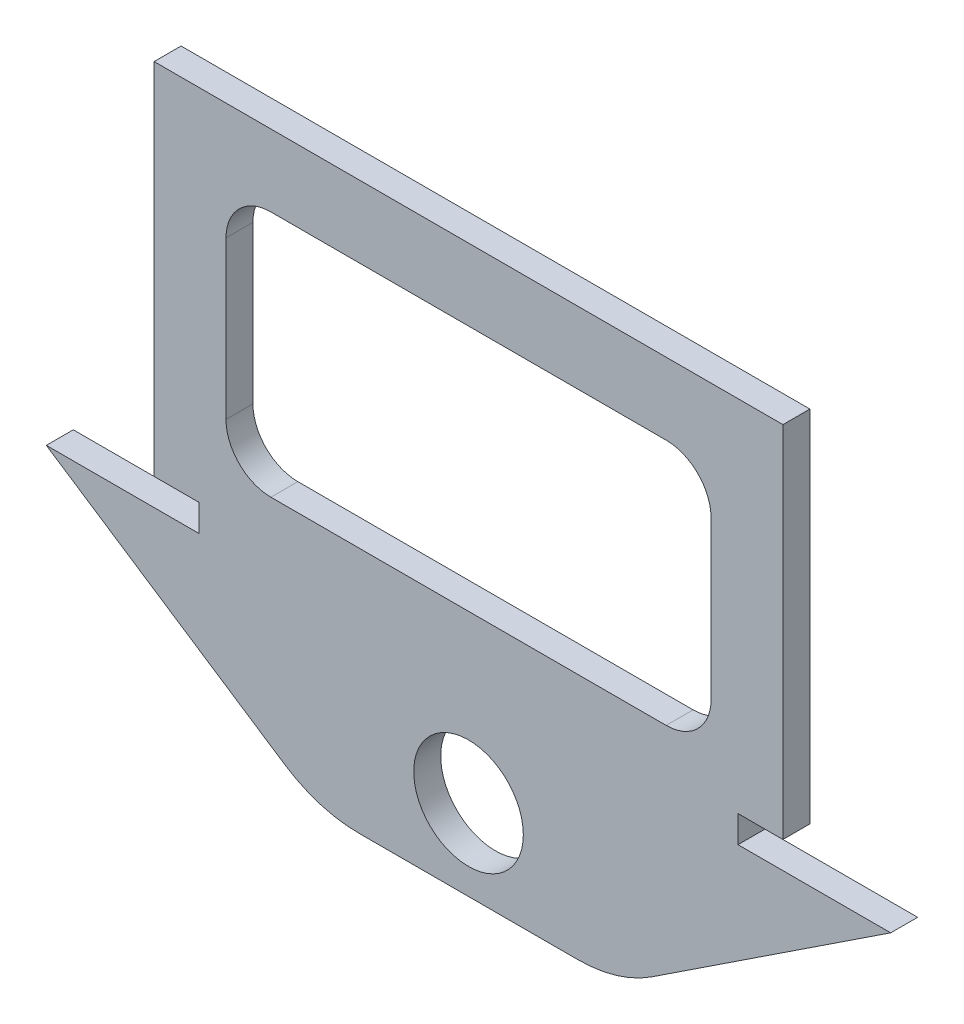
ISO-10303-21;
HEADER;
FILE_DESCRIPTION(('STEP AP214'),'2;1');
FILE_NAME('part.step','',(''),(''),'','','');
FILE_SCHEMA(('AUTOMOTIVE_DESIGN { 1 0 10303 214 1 1 1 1 }'));
ENDSEC;
DATA;
#1=APPLICATION_CONTEXT('core data for automotive mechanical design processes');
#2=APPLICATION_PROTOCOL_DEFINITION('international standard','automotive_design',2000,#1);
#3=PRODUCT_CONTEXT('',#1,'mechanical');
#4=PRODUCT('Part','Part','',(#3));
#5=PRODUCT_RELATED_PRODUCT_CATEGORY('part','',(#4));
#6=PRODUCT_DEFINITION_FORMATION('','',#4);
#7=PRODUCT_DEFINITION_CONTEXT('part definition',#1,'design');
#8=PRODUCT_DEFINITION('design','',#6,#7);
#9=PRODUCT_DEFINITION_SHAPE('','',#8);
#10=(LENGTH_UNIT() NAMED_UNIT(*) SI_UNIT(.MILLI.,.METRE.));
#11=(NAMED_UNIT(*) PLANE_ANGLE_UNIT() SI_UNIT($,.RADIAN.));
#12=(NAMED_UNIT(*) SI_UNIT($,.STERADIAN.) SOLID_ANGLE_UNIT());
#13=UNCERTAINTY_MEASURE_WITH_UNIT(LENGTH_MEASURE(1.E-05),#10,'distance_accuracy_value','');
#14=(GEOMETRIC_REPRESENTATION_CONTEXT(3) GLOBAL_UNCERTAINTY_ASSIGNED_CONTEXT((#13)) GLOBAL_UNIT_ASSIGNED_CONTEXT((#10,
#11,#12)) REPRESENTATION_CONTEXT('',''));
#15=CARTESIAN_POINT('',(0.,0.,0.));
#16=DIRECTION('',(0.,0.,1.));
#17=DIRECTION('',(1.,0.,0.));
#18=AXIS2_PLACEMENT_3D('',#15,#16,#17);
#19=CARTESIAN_POINT('',(-24.3453074442024,-10.,6.));
#20=DIRECTION('',(0.,0.,1.));
#21=DIRECTION('',(1.,0.,0.));
#22=AXIS2_PLACEMENT_3D('',#19,#20,#21);
#23=PLANE('',#22);
#24=DIRECTION('',(0.,-1.,0.));
#25=VECTOR('',#24,1.);
#26=CARTESIAN_POINT('',(-54.,60.,6.));
#27=LINE('',#26,#25);
#28=CARTESIAN_POINT('',(-54.,60.,6.));
#29=VERTEX_POINT('',#28);
#30=CARTESIAN_POINT('',(-54.,25.,6.));
#31=VERTEX_POINT('',#30);
#32=EDGE_CURVE('E189',#29,#31,#27,.T.);
#33=ORIENTED_EDGE('',*,*,#32,.F.);
#34=CARTESIAN_POINT('',(-44.,60.,6.));
#35=DIRECTION('',(0.,0.,1.));
#36=DIRECTION('',(1.,0.,0.));
#37=AXIS2_PLACEMENT_3D('',#34,#35,#36);
#38=CIRCLE('',#37,10.);
#39=CARTESIAN_POINT('',(-44.,70.,6.));
#40=VERTEX_POINT('',#39);
#41=EDGE_CURVE('E181',#40,#29,#38,.T.);
#42=ORIENTED_EDGE('',*,*,#41,.F.);
#43=DIRECTION('',(-1.,0.,0.));
#44=VECTOR('',#43,1.);
#45=CARTESIAN_POINT('',(-44.,70.,6.));
#46=LINE('',#45,#44);
#47=CARTESIAN_POINT('',(44.,70.,6.));
#48=VERTEX_POINT('',#47);
#49=EDGE_CURVE('E216',#48,#40,#46,.T.);
#50=ORIENTED_EDGE('',*,*,#49,.F.);
#51=CARTESIAN_POINT('',(44.,60.,6.));
#52=DIRECTION('',(0.,0.,1.));
#53=DIRECTION('',(-1.,0.,0.));
#54=AXIS2_PLACEMENT_3D('',#51,#52,#53);
#55=CIRCLE('',#54,10.);
#56=CARTESIAN_POINT('',(54.,60.,6.));
#57=VERTEX_POINT('',#56);
#58=EDGE_CURVE('E214',#57,#48,#55,.T.);
#59=ORIENTED_EDGE('',*,*,#58,.F.);
#60=DIRECTION('',(0.,1.,0.));
#61=VECTOR('',#60,1.);
#62=CARTESIAN_POINT('',(54.,60.,6.));
#63=LINE('',#62,#61);
#64=CARTESIAN_POINT('',(54.,25.,6.));
#65=VERTEX_POINT('',#64);
#66=EDGE_CURVE('E212',#65,#57,#63,.T.);
#67=ORIENTED_EDGE('',*,*,#66,.F.);
#68=CARTESIAN_POINT('',(44.,25.,6.));
#69=DIRECTION('',(0.,0.,1.));
#70=DIRECTION('',(-1.,0.,0.));
#71=AXIS2_PLACEMENT_3D('',#68,#69,#70);
#72=CIRCLE('',#71,10.);
#73=CARTESIAN_POINT('',(44.,15.,6.));
#74=VERTEX_POINT('',#73);
#75=EDGE_CURVE('E210',#74,#65,#72,.T.);
#76=ORIENTED_EDGE('',*,*,#75,.F.);
#77=DIRECTION('',(1.,0.,0.));
#78=VECTOR('',#77,1.);
#79=CARTESIAN_POINT('',(-44.,15.,6.));
#80=LINE('',#79,#78);
#81=CARTESIAN_POINT('',(-44.,15.,6.));
#82=VERTEX_POINT('',#81);
#83=EDGE_CURVE('E205',#82,#74,#80,.T.);
#84=ORIENTED_EDGE('',*,*,#83,.F.);
#85=CARTESIAN_POINT('',(-44.,25.,6.));
#86=DIRECTION('',(0.,0.,1.));
#87=DIRECTION('',(1.,0.,0.));
#88=AXIS2_PLACEMENT_3D('',#85,#86,#87);
#89=CIRCLE('',#88,10.);
#90=EDGE_CURVE('E203',#31,#82,#89,.T.);
#91=ORIENTED_EDGE('',*,*,#90,.F.);
#92=EDGE_LOOP('',(#33,#42,#50,#59,#67,#76,#84,#91));
#93=FACE_BOUND('',#92,.T.);
#94=DIRECTION('',(0.834805382866256,-0.550545159580505,0.));
#95=VECTOR('',#94,1.);
#96=CARTESIAN_POINT('',(-94.,0.,6.));
#97=LINE('',#96,#95);
#98=CARTESIAN_POINT('',(-94.,0.,6.));
#99=VERTEX_POINT('',#98);
#100=CARTESIAN_POINT('',(-40.8616622316176,-35.0441614859877,6.));
#101=VERTEX_POINT('',#100);
#102=EDGE_CURVE('E249',#99,#101,#97,.T.);
#103=ORIENTED_EDGE('',*,*,#102,.T.);
#104=CARTESIAN_POINT('',(-24.3453074442024,-10.,6.));
#105=DIRECTION('',(0.,0.,1.));
#106=DIRECTION('',(1.,0.,0.));
#107=AXIS2_PLACEMENT_3D('',#104,#105,#106);
#108=CIRCLE('',#107,30.);
#109=CARTESIAN_POINT('',(-24.3453074442024,-40.,6.));
#110=VERTEX_POINT('',#109);
#111=EDGE_CURVE('E252',#101,#110,#108,.T.);
#112=ORIENTED_EDGE('',*,*,#111,.T.);
#113=DIRECTION('',(1.,0.,0.));
#114=VECTOR('',#113,1.);
#115=CARTESIAN_POINT('',(-24.3453074442024,-40.,6.));
#116=LINE('',#115,#114);
#117=CARTESIAN_POINT('',(24.3453074442025,-40.,6.));
#118=VERTEX_POINT('',#117);
#119=EDGE_CURVE('E255',#110,#118,#116,.T.);
#120=ORIENTED_EDGE('',*,*,#119,.T.);
#121=CARTESIAN_POINT('',(24.3453074442025,-10.,6.));
#122=DIRECTION('',(0.,0.,1.));
#123=DIRECTION('',(-1.,0.,0.));
#124=AXIS2_PLACEMENT_3D('',#121,#122,#123);
#125=CIRCLE('',#124,30.);
#126=CARTESIAN_POINT('',(40.8616622316176,-35.0441614859877,6.));
#127=VERTEX_POINT('',#126);
#128=EDGE_CURVE('E257',#118,#127,#125,.T.);
#129=ORIENTED_EDGE('',*,*,#128,.T.);
#130=DIRECTION('',(0.834805382866256,0.550545159580505,0.));
#131=VECTOR('',#130,1.);
#132=CARTESIAN_POINT('',(94.,0.,6.));
#133=LINE('',#132,#131);
#134=CARTESIAN_POINT('',(94.,0.,6.));
#135=VERTEX_POINT('',#134);
#136=EDGE_CURVE('E259',#127,#135,#133,.T.);
#137=ORIENTED_EDGE('',*,*,#136,.T.);
#138=DIRECTION('',(-1.,0.,0.));
#139=VECTOR('',#138,1.);
#140=CARTESIAN_POINT('',(94.,0.,6.));
#141=LINE('',#140,#139);
#142=CARTESIAN_POINT('',(60.,0.,6.));
#143=VERTEX_POINT('',#142);
#144=EDGE_CURVE('E261',#135,#143,#141,.T.);
#145=ORIENTED_EDGE('',*,*,#144,.T.);
#146=DIRECTION('',(0.,1.,0.));
#147=VECTOR('',#146,1.);
#148=CARTESIAN_POINT('',(60.,0.,6.));
#149=LINE('',#148,#147);
#150=CARTESIAN_POINT('',(60.,6.00000000000005,6.));
#151=VERTEX_POINT('',#150);
#152=EDGE_CURVE('E263',#143,#151,#149,.T.);
#153=ORIENTED_EDGE('',*,*,#152,.T.);
#154=DIRECTION('',(1.,0.,0.));
#155=VECTOR('',#154,1.);
#156=CARTESIAN_POINT('',(60.,6.00000000000005,6.));
#157=LINE('',#156,#155);
#158=CARTESIAN_POINT('',(70.,6.00000000000005,6.));
#159=VERTEX_POINT('',#158);
#160=EDGE_CURVE('E265',#151,#159,#157,.T.);
#161=ORIENTED_EDGE('',*,*,#160,.T.);
#162=DIRECTION('',(0.,1.,0.));
#163=VECTOR('',#162,1.);
#164=CARTESIAN_POINT('',(70.,6.00000000000005,6.));
#165=LINE('',#164,#163);
#166=CARTESIAN_POINT('',(70.,86.,6.));
#167=VERTEX_POINT('',#166);
#168=EDGE_CURVE('E267',#159,#167,#165,.T.);
#169=ORIENTED_EDGE('',*,*,#168,.T.);
#170=DIRECTION('',(-1.,0.,0.));
#171=VECTOR('',#170,1.);
#172=CARTESIAN_POINT('',(-70.,86.,6.));
#173=LINE('',#172,#171);
#174=CARTESIAN_POINT('',(-70.,86.,6.));
#175=VERTEX_POINT('',#174);
#176=EDGE_CURVE('E269',#167,#175,#173,.T.);
#177=ORIENTED_EDGE('',*,*,#176,.T.);
#178=DIRECTION('',(0.,-1.,0.));
#179=VECTOR('',#178,1.);
#180=CARTESIAN_POINT('',(-70.,6.,6.));
#181=LINE('',#180,#179);
#182=CARTESIAN_POINT('',(-70.,6.,6.));
#183=VERTEX_POINT('',#182);
#184=EDGE_CURVE('E271',#175,#183,#181,.T.);
#185=ORIENTED_EDGE('',*,*,#184,.T.);
#186=DIRECTION('',(1.,0.,0.));
#187=VECTOR('',#186,1.);
#188=CARTESIAN_POINT('',(-60.,6.,6.));
#189=LINE('',#188,#187);
#190=CARTESIAN_POINT('',(-60.,6.,6.));
#191=VERTEX_POINT('',#190);
#192=EDGE_CURVE('E273',#183,#191,#189,.T.);
#193=ORIENTED_EDGE('',*,*,#192,.T.);
#194=DIRECTION('',(0.,-1.,0.));
#195=VECTOR('',#194,1.);
#196=CARTESIAN_POINT('',(-60.,0.,6.));
#197=LINE('',#196,#195);
#198=CARTESIAN_POINT('',(-60.,0.,6.));
#199=VERTEX_POINT('',#198);
#200=EDGE_CURVE('E275',#191,#199,#197,.T.);
#201=ORIENTED_EDGE('',*,*,#200,.T.);
#202=DIRECTION('',(-1.,0.,0.));
#203=VECTOR('',#202,1.);
#204=CARTESIAN_POINT('',(-94.,0.,6.));
#205=LINE('',#204,#203);
#206=EDGE_CURVE('E277',#199,#99,#205,.T.);
#207=ORIENTED_EDGE('',*,*,#206,.T.);
#208=EDGE_LOOP('',(#103,#112,#120,#129,#137,#145,#153,#161,#169,#177,#185,#193,#201,#207));
#209=FACE_BOUND('',#208,.T.);
#210=CARTESIAN_POINT('',(0.,-22.,6.));
#211=DIRECTION('',(0.,0.,1.));
#212=DIRECTION('',(1.,0.,0.));
#213=AXIS2_PLACEMENT_3D('',#210,#211,#212);
#214=CIRCLE('',#213,12.2);
#215=CARTESIAN_POINT('',(12.2,-22.,6.));
#216=VERTEX_POINT('',#215);
#217=EDGE_CURVE('E219',#216,#216,#214,.T.);
#218=ORIENTED_EDGE('',*,*,#217,.F.);
#219=EDGE_LOOP('',(#218));
#220=FACE_BOUND('',#219,.T.);
#221=ADVANCED_FACE('F32',(#93,#209,#220),#23,.T.);
#222=CARTESIAN_POINT('',(-24.3453074442024,-10.,0.));
#223=DIRECTION('',(0.,0.,1.));
#224=DIRECTION('',(1.,0.,0.));
#225=AXIS2_PLACEMENT_3D('',#222,#223,#224);
#226=PLANE('',#225);
#227=DIRECTION('',(0.834805382866256,-0.550545159580505,0.));
#228=VECTOR('',#227,1.);
#229=CARTESIAN_POINT('',(-94.,0.,0.));
#230=LINE('',#229,#228);
#231=CARTESIAN_POINT('',(-94.,0.,0.));
#232=VERTEX_POINT('',#231);
#233=CARTESIAN_POINT('',(-40.8616622316176,-35.0441614859877,0.));
#234=VERTEX_POINT('',#233);
#235=EDGE_CURVE('E197',#232,#234,#230,.T.);
#236=ORIENTED_EDGE('',*,*,#235,.F.);
#237=DIRECTION('',(-1.,0.,0.));
#238=VECTOR('',#237,1.);
#239=CARTESIAN_POINT('',(-94.,0.,0.));
#240=LINE('',#239,#238);
#241=CARTESIAN_POINT('',(-60.,0.,0.));
#242=VERTEX_POINT('',#241);
#243=EDGE_CURVE('E253',#242,#232,#240,.T.);
#244=ORIENTED_EDGE('',*,*,#243,.F.);
#245=DIRECTION('',(0.,-1.,0.));
#246=VECTOR('',#245,1.);
#247=CARTESIAN_POINT('',(-60.,0.,0.));
#248=LINE('',#247,#246);
#249=CARTESIAN_POINT('',(-60.,6.,0.));
#250=VERTEX_POINT('',#249);
#251=EDGE_CURVE('E304',#250,#242,#248,.T.);
#252=ORIENTED_EDGE('',*,*,#251,.F.);
#253=DIRECTION('',(1.,0.,0.));
#254=VECTOR('',#253,1.);
#255=CARTESIAN_POINT('',(-60.,6.,0.));
#256=LINE('',#255,#254);
#257=CARTESIAN_POINT('',(-70.,6.,0.));
#258=VERTEX_POINT('',#257);
#259=EDGE_CURVE('E302',#258,#250,#256,.T.);
#260=ORIENTED_EDGE('',*,*,#259,.F.);
#261=DIRECTION('',(0.,-1.,0.));
#262=VECTOR('',#261,1.);
#263=CARTESIAN_POINT('',(-70.,6.,0.));
#264=LINE('',#263,#262);
#265=CARTESIAN_POINT('',(-70.,86.,0.));
#266=VERTEX_POINT('',#265);
#267=EDGE_CURVE('E300',#266,#258,#264,.T.);
#268=ORIENTED_EDGE('',*,*,#267,.F.);
#269=DIRECTION('',(-1.,0.,0.));
#270=VECTOR('',#269,1.);
#271=CARTESIAN_POINT('',(-70.,86.,0.));
#272=LINE('',#271,#270);
#273=CARTESIAN_POINT('',(70.,86.,0.));
#274=VERTEX_POINT('',#273);
#275=EDGE_CURVE('E298',#274,#266,#272,.T.);
#276=ORIENTED_EDGE('',*,*,#275,.F.);
#277=DIRECTION('',(0.,1.,0.));
#278=VECTOR('',#277,1.);
#279=CARTESIAN_POINT('',(70.,6.00000000000005,0.));
#280=LINE('',#279,#278);
#281=CARTESIAN_POINT('',(70.,6.00000000000005,0.));
#282=VERTEX_POINT('',#281);
#283=EDGE_CURVE('E296',#282,#274,#280,.T.);
#284=ORIENTED_EDGE('',*,*,#283,.F.);
#285=DIRECTION('',(1.,0.,0.));
#286=VECTOR('',#285,1.);
#287=CARTESIAN_POINT('',(60.,6.00000000000005,0.));
#288=LINE('',#287,#286);
#289=CARTESIAN_POINT('',(60.,6.00000000000005,0.));
#290=VERTEX_POINT('',#289);
#291=EDGE_CURVE('E294',#290,#282,#288,.T.);
#292=ORIENTED_EDGE('',*,*,#291,.F.);
#293=DIRECTION('',(0.,1.,0.));
#294=VECTOR('',#293,1.);
#295=CARTESIAN_POINT('',(60.,0.,0.));
#296=LINE('',#295,#294);
#297=CARTESIAN_POINT('',(60.,0.,0.));
#298=VERTEX_POINT('',#297);
#299=EDGE_CURVE('E292',#298,#290,#296,.T.);
#300=ORIENTED_EDGE('',*,*,#299,.F.);
#301=DIRECTION('',(-1.,0.,0.));
#302=VECTOR('',#301,1.);
#303=CARTESIAN_POINT('',(94.,0.,0.));
#304=LINE('',#303,#302);
#305=CARTESIAN_POINT('',(94.,0.,0.));
#306=VERTEX_POINT('',#305);
#307=EDGE_CURVE('E290',#306,#298,#304,.T.);
#308=ORIENTED_EDGE('',*,*,#307,.F.);
#309=DIRECTION('',(0.834805382866256,0.550545159580505,0.));
#310=VECTOR('',#309,1.);
#311=CARTESIAN_POINT('',(94.,0.,0.));
#312=LINE('',#311,#310);
#313=CARTESIAN_POINT('',(40.8616622316176,-35.0441614859877,0.));
#314=VERTEX_POINT('',#313);
#315=EDGE_CURVE('E288',#314,#306,#312,.T.);
#316=ORIENTED_EDGE('',*,*,#315,.F.);
#317=CARTESIAN_POINT('',(24.3453074442025,-10.,0.));
#318=DIRECTION('',(0.,0.,1.));
#319=DIRECTION('',(-1.,0.,0.));
#320=AXIS2_PLACEMENT_3D('',#317,#318,#319);
#321=CIRCLE('',#320,30.);
#322=CARTESIAN_POINT('',(24.3453074442025,-40.,0.));
#323=VERTEX_POINT('',#322);
#324=EDGE_CURVE('E286',#323,#314,#321,.T.);
#325=ORIENTED_EDGE('',*,*,#324,.F.);
#326=DIRECTION('',(1.,0.,0.));
#327=VECTOR('',#326,1.);
#328=CARTESIAN_POINT('',(-24.3453074442024,-40.,0.));
#329=LINE('',#328,#327);
#330=CARTESIAN_POINT('',(-24.3453074442024,-40.,0.));
#331=VERTEX_POINT('',#330);
#332=EDGE_CURVE('E284',#331,#323,#329,.T.);
#333=ORIENTED_EDGE('',*,*,#332,.F.);
#334=CARTESIAN_POINT('',(-24.3453074442024,-10.,0.));
#335=DIRECTION('',(0.,0.,1.));
#336=DIRECTION('',(1.,0.,0.));
#337=AXIS2_PLACEMENT_3D('',#334,#335,#336);
#338=CIRCLE('',#337,30.);
#339=EDGE_CURVE('E282',#234,#331,#338,.T.);
#340=ORIENTED_EDGE('',*,*,#339,.F.);
#341=EDGE_LOOP('',(#236,#244,#252,#260,#268,#276,#284,#292,#300,#308,#316,#325,#333,#340));
#342=FACE_BOUND('',#341,.T.);
#343=CARTESIAN_POINT('',(-44.,60.,0.));
#344=DIRECTION('',(0.,0.,1.));
#345=DIRECTION('',(1.,0.,0.));
#346=AXIS2_PLACEMENT_3D('',#343,#344,#345);
#347=CIRCLE('',#346,10.);
#348=CARTESIAN_POINT('',(-44.,70.,0.));
#349=VERTEX_POINT('',#348);
#350=CARTESIAN_POINT('',(-54.,60.,0.));
#351=VERTEX_POINT('',#350);
#352=EDGE_CURVE('E55',#349,#351,#347,.T.);
#353=ORIENTED_EDGE('',*,*,#352,.T.);
#354=DIRECTION('',(0.,-1.,0.));
#355=VECTOR('',#354,1.);
#356=CARTESIAN_POINT('',(-54.,60.,0.));
#357=LINE('',#356,#355);
#358=CARTESIAN_POINT('',(-54.,25.,0.));
#359=VERTEX_POINT('',#358);
#360=EDGE_CURVE('E196',#351,#359,#357,.T.);
#361=ORIENTED_EDGE('',*,*,#360,.T.);
#362=CARTESIAN_POINT('',(-44.,25.,0.));
#363=DIRECTION('',(0.,0.,1.));
#364=DIRECTION('',(1.,0.,0.));
#365=AXIS2_PLACEMENT_3D('',#362,#363,#364);
#366=CIRCLE('',#365,10.);
#367=CARTESIAN_POINT('',(-44.,15.,0.));
#368=VERTEX_POINT('',#367);
#369=EDGE_CURVE('E221',#359,#368,#366,.T.);
#370=ORIENTED_EDGE('',*,*,#369,.T.);
#371=DIRECTION('',(1.,0.,0.));
#372=VECTOR('',#371,1.);
#373=CARTESIAN_POINT('',(-44.,15.,0.));
#374=LINE('',#373,#372);
#375=CARTESIAN_POINT('',(44.,15.,0.));
#376=VERTEX_POINT('',#375);
#377=EDGE_CURVE('E224',#368,#376,#374,.T.);
#378=ORIENTED_EDGE('',*,*,#377,.T.);
#379=CARTESIAN_POINT('',(44.,25.,0.));
#380=DIRECTION('',(0.,0.,1.));
#381=DIRECTION('',(-1.,0.,0.));
#382=AXIS2_PLACEMENT_3D('',#379,#380,#381);
#383=CIRCLE('',#382,10.);
#384=CARTESIAN_POINT('',(54.,25.,0.));
#385=VERTEX_POINT('',#384);
#386=EDGE_CURVE('E227',#376,#385,#383,.T.);
#387=ORIENTED_EDGE('',*,*,#386,.T.);
#388=DIRECTION('',(0.,1.,0.));
#389=VECTOR('',#388,1.);
#390=CARTESIAN_POINT('',(54.,60.,0.));
#391=LINE('',#390,#389);
#392=CARTESIAN_POINT('',(54.,60.,0.));
#393=VERTEX_POINT('',#392);
#394=EDGE_CURVE('E230',#385,#393,#391,.T.);
#395=ORIENTED_EDGE('',*,*,#394,.T.);
#396=CARTESIAN_POINT('',(44.,60.,0.));
#397=DIRECTION('',(0.,0.,1.));
#398=DIRECTION('',(-1.,0.,0.));
#399=AXIS2_PLACEMENT_3D('',#396,#397,#398);
#400=CIRCLE('',#399,10.);
#401=CARTESIAN_POINT('',(44.,70.,0.));
#402=VERTEX_POINT('',#401);
#403=EDGE_CURVE('E233',#393,#402,#400,.T.);
#404=ORIENTED_EDGE('',*,*,#403,.T.);
#405=DIRECTION('',(-1.,0.,0.));
#406=VECTOR('',#405,1.);
#407=CARTESIAN_POINT('',(-44.,70.,0.));
#408=LINE('',#407,#406);
#409=EDGE_CURVE('E190',#402,#349,#408,.T.);
#410=ORIENTED_EDGE('',*,*,#409,.T.);
#411=EDGE_LOOP('',(#353,#361,#370,#378,#387,#395,#404,#410));
#412=FACE_BOUND('',#411,.T.);
#413=CARTESIAN_POINT('',(0.,-22.,0.));
#414=DIRECTION('',(0.,0.,1.));
#415=DIRECTION('',(1.,0.,0.));
#416=AXIS2_PLACEMENT_3D('',#413,#414,#415);
#417=CIRCLE('',#416,12.2);
#418=CARTESIAN_POINT('',(12.2,-22.,0.));
#419=VERTEX_POINT('',#418);
#420=EDGE_CURVE('E629',#419,#419,#417,.T.);
#421=ORIENTED_EDGE('',*,*,#420,.T.);
#422=EDGE_LOOP('',(#421));
#423=FACE_BOUND('',#422,.T.);
#424=ADVANCED_FACE('F352',(#342,#412,#423),#226,.F.);
#425=CARTESIAN_POINT('',(-94.,0.,6.));
#426=DIRECTION('',(0.550545159580505,0.834805382866256,0.));
#427=DIRECTION('',(-0.834805382866256,0.550545159580505,0.));
#428=AXIS2_PLACEMENT_3D('',#425,#426,#427);
#429=PLANE('',#428);
#430=ORIENTED_EDGE('',*,*,#235,.T.);
#431=DIRECTION('',(0.,0.,-1.));
#432=VECTOR('',#431,1.);
#433=CARTESIAN_POINT('',(-40.8616622316176,-35.0441614859877,6.));
#434=LINE('',#433,#432);
#435=EDGE_CURVE('E11',#101,#234,#434,.T.);
#436=ORIENTED_EDGE('',*,*,#435,.F.);
#437=ORIENTED_EDGE('',*,*,#102,.F.);
#438=DIRECTION('',(0.,0.,-1.));
#439=VECTOR('',#438,1.);
#440=CARTESIAN_POINT('',(-94.,0.,6.));
#441=LINE('',#440,#439);
#442=EDGE_CURVE('E279',#99,#232,#441,.T.);
#443=ORIENTED_EDGE('',*,*,#442,.T.);
#444=EDGE_LOOP('',(#430,#436,#437,#443));
#445=FACE_BOUND('',#444,.T.);
#446=ADVANCED_FACE('F34',(#445),#429,.F.);
#447=CARTESIAN_POINT('',(-24.3453074442024,-10.,6.));
#448=DIRECTION('',(0.,0.,-1.));
#449=DIRECTION('',(-1.,0.,0.));
#450=AXIS2_PLACEMENT_3D('',#447,#448,#449);
#451=CYLINDRICAL_SURFACE('',#450,30.);
#452=ORIENTED_EDGE('',*,*,#339,.T.);
#453=DIRECTION('',(0.,0.,-1.));
#454=VECTOR('',#453,1.);
#455=CARTESIAN_POINT('',(-24.3453074442024,-40.,6.));
#456=LINE('',#455,#454);
#457=EDGE_CURVE('E40',#110,#331,#456,.T.);
#458=ORIENTED_EDGE('',*,*,#457,.F.);
#459=ORIENTED_EDGE('',*,*,#111,.F.);
#460=ORIENTED_EDGE('',*,*,#435,.T.);
#461=EDGE_LOOP('',(#452,#458,#459,#460));
#462=FACE_BOUND('',#461,.T.);
#463=ADVANCED_FACE('F369',(#462),#451,.T.);
#464=CARTESIAN_POINT('',(-24.3453074442024,-40.,6.));
#465=DIRECTION('',(0.,1.,0.));
#466=DIRECTION('',(-1.,0.,0.));
#467=AXIS2_PLACEMENT_3D('',#464,#465,#466);
#468=PLANE('',#467);
#469=ORIENTED_EDGE('',*,*,#332,.T.);
#470=DIRECTION('',(0.,0.,-1.));
#471=VECTOR('',#470,1.);
#472=CARTESIAN_POINT('',(24.3453074442025,-40.,6.));
#473=LINE('',#472,#471);
#474=EDGE_CURVE('E339',#118,#323,#473,.T.);
#475=ORIENTED_EDGE('',*,*,#474,.F.);
#476=ORIENTED_EDGE('',*,*,#119,.F.);
#477=ORIENTED_EDGE('',*,*,#457,.T.);
#478=EDGE_LOOP('',(#469,#475,#476,#477));
#479=FACE_BOUND('',#478,.T.);
#480=ADVANCED_FACE('F346',(#479),#468,.F.);
#481=CARTESIAN_POINT('',(24.3453074442025,-10.,6.));
#482=DIRECTION('',(0.,0.,-1.));
#483=DIRECTION('',(-1.,0.,0.));
#484=AXIS2_PLACEMENT_3D('',#481,#482,#483);
#485=CYLINDRICAL_SURFACE('',#484,30.);
#486=ORIENTED_EDGE('',*,*,#324,.T.);
#487=DIRECTION('',(0.,0.,-1.));
#488=VECTOR('',#487,1.);
#489=CARTESIAN_POINT('',(40.8616622316176,-35.0441614859877,6.));
#490=LINE('',#489,#488);
#491=EDGE_CURVE('E336',#127,#314,#490,.T.);
#492=ORIENTED_EDGE('',*,*,#491,.F.);
#493=ORIENTED_EDGE('',*,*,#128,.F.);
#494=ORIENTED_EDGE('',*,*,#474,.T.);
#495=EDGE_LOOP('',(#486,#492,#493,#494));
#496=FACE_BOUND('',#495,.T.);
#497=ADVANCED_FACE('F358',(#496),#485,.T.);
#498=CARTESIAN_POINT('',(94.,0.,6.));
#499=DIRECTION('',(-0.550545159580505,0.834805382866256,0.));
#500=DIRECTION('',(-0.834805382866256,-0.550545159580505,0.));
#501=AXIS2_PLACEMENT_3D('',#498,#499,#500);
#502=PLANE('',#501);
#503=ORIENTED_EDGE('',*,*,#315,.T.);
#504=DIRECTION('',(0.,0.,-1.));
#505=VECTOR('',#504,1.);
#506=CARTESIAN_POINT('',(94.,0.,6.));
#507=LINE('',#506,#505);
#508=EDGE_CURVE('E333',#135,#306,#507,.T.);
#509=ORIENTED_EDGE('',*,*,#508,.F.);
#510=ORIENTED_EDGE('',*,*,#136,.F.);
#511=ORIENTED_EDGE('',*,*,#491,.T.);
#512=EDGE_LOOP('',(#503,#509,#510,#511));
#513=FACE_BOUND('',#512,.T.);
#514=ADVANCED_FACE('F362',(#513),#502,.F.);
#515=CARTESIAN_POINT('',(94.,0.,6.));
#516=DIRECTION('',(0.,-1.,0.));
#517=DIRECTION('',(1.,0.,0.));
#518=AXIS2_PLACEMENT_3D('',#515,#516,#517);
#519=PLANE('',#518);
#520=ORIENTED_EDGE('',*,*,#307,.T.);
#521=DIRECTION('',(0.,0.,-1.));
#522=VECTOR('',#521,1.);
#523=CARTESIAN_POINT('',(60.,0.,6.));
#524=LINE('',#523,#522);
#525=EDGE_CURVE('E330',#143,#298,#524,.T.);
#526=ORIENTED_EDGE('',*,*,#525,.F.);
#527=ORIENTED_EDGE('',*,*,#144,.F.);
#528=ORIENTED_EDGE('',*,*,#508,.T.);
#529=EDGE_LOOP('',(#520,#526,#527,#528));
#530=FACE_BOUND('',#529,.T.);
#531=ADVANCED_FACE('F412',(#530),#519,.F.);
#532=CARTESIAN_POINT('',(60.,0.,6.));
#533=DIRECTION('',(-1.,0.,0.));
#534=DIRECTION('',(0.,0.,1.));
#535=AXIS2_PLACEMENT_3D('',#532,#533,#534);
#536=PLANE('',#535);
#537=ORIENTED_EDGE('',*,*,#299,.T.);
#538=DIRECTION('',(0.,0.,-1.));
#539=VECTOR('',#538,1.);
#540=CARTESIAN_POINT('',(60.,6.00000000000005,6.));
#541=LINE('',#540,#539);
#542=EDGE_CURVE('E327',#151,#290,#541,.T.);
#543=ORIENTED_EDGE('',*,*,#542,.F.);
#544=ORIENTED_EDGE('',*,*,#152,.F.);
#545=ORIENTED_EDGE('',*,*,#525,.T.);
#546=EDGE_LOOP('',(#537,#543,#544,#545));
#547=FACE_BOUND('',#546,.T.);
#548=ADVANCED_FACE('F410',(#547),#536,.F.);
#549=CARTESIAN_POINT('',(60.,6.00000000000005,6.));
#550=DIRECTION('',(0.,1.,0.));
#551=DIRECTION('',(0.,0.,1.));
#552=AXIS2_PLACEMENT_3D('',#549,#550,#551);
#553=PLANE('',#552);
#554=ORIENTED_EDGE('',*,*,#291,.T.);
#555=DIRECTION('',(0.,0.,-1.));
#556=VECTOR('',#555,1.);
#557=CARTESIAN_POINT('',(70.,6.00000000000005,6.));
#558=LINE('',#557,#556);
#559=EDGE_CURVE('E324',#159,#282,#558,.T.);
#560=ORIENTED_EDGE('',*,*,#559,.F.);
#561=ORIENTED_EDGE('',*,*,#160,.F.);
#562=ORIENTED_EDGE('',*,*,#542,.T.);
#563=EDGE_LOOP('',(#554,#560,#561,#562));
#564=FACE_BOUND('',#563,.T.);
#565=ADVANCED_FACE('F405',(#564),#553,.F.);
#566=CARTESIAN_POINT('',(70.,6.00000000000005,6.));
#567=DIRECTION('',(-1.,0.,0.));
#568=DIRECTION('',(0.,0.,1.));
#569=AXIS2_PLACEMENT_3D('',#566,#567,#568);
#570=PLANE('',#569);
#571=ORIENTED_EDGE('',*,*,#283,.T.);
#572=DIRECTION('',(0.,0.,-1.));
#573=VECTOR('',#572,1.);
#574=CARTESIAN_POINT('',(70.,86.,6.));
#575=LINE('',#574,#573);
#576=EDGE_CURVE('E321',#167,#274,#575,.T.);
#577=ORIENTED_EDGE('',*,*,#576,.F.);
#578=ORIENTED_EDGE('',*,*,#168,.F.);
#579=ORIENTED_EDGE('',*,*,#559,.T.);
#580=EDGE_LOOP('',(#571,#577,#578,#579));
#581=FACE_BOUND('',#580,.T.);
#582=ADVANCED_FACE('F400',(#581),#570,.F.);
#583=CARTESIAN_POINT('',(-70.,86.,6.));
#584=DIRECTION('',(0.,-1.,0.));
#585=DIRECTION('',(1.,0.,0.));
#586=AXIS2_PLACEMENT_3D('',#583,#584,#585);
#587=PLANE('',#586);
#588=ORIENTED_EDGE('',*,*,#275,.T.);
#589=DIRECTION('',(0.,0.,-1.));
#590=VECTOR('',#589,1.);
#591=CARTESIAN_POINT('',(-70.,86.,6.));
#592=LINE('',#591,#590);
#593=EDGE_CURVE('E318',#175,#266,#592,.T.);
#594=ORIENTED_EDGE('',*,*,#593,.F.);
#595=ORIENTED_EDGE('',*,*,#176,.F.);
#596=ORIENTED_EDGE('',*,*,#576,.T.);
#597=EDGE_LOOP('',(#588,#594,#595,#596));
#598=FACE_BOUND('',#597,.T.);
#599=ADVANCED_FACE('F396',(#598),#587,.F.);
#600=CARTESIAN_POINT('',(-70.,6.,6.));
#601=DIRECTION('',(1.,0.,0.));
#602=DIRECTION('',(0.,0.,-1.));
#603=AXIS2_PLACEMENT_3D('',#600,#601,#602);
#604=PLANE('',#603);
#605=ORIENTED_EDGE('',*,*,#267,.T.);
#606=DIRECTION('',(0.,0.,-1.));
#607=VECTOR('',#606,1.);
#608=CARTESIAN_POINT('',(-70.,6.,6.));
#609=LINE('',#608,#607);
#610=EDGE_CURVE('E315',#183,#258,#609,.T.);
#611=ORIENTED_EDGE('',*,*,#610,.F.);
#612=ORIENTED_EDGE('',*,*,#184,.F.);
#613=ORIENTED_EDGE('',*,*,#593,.T.);
#614=EDGE_LOOP('',(#605,#611,#612,#613));
#615=FACE_BOUND('',#614,.T.);
#616=ADVANCED_FACE('F391',(#615),#604,.F.);
#617=CARTESIAN_POINT('',(-60.,6.,6.));
#618=DIRECTION('',(0.,1.,0.));
#619=DIRECTION('',(0.,0.,1.));
#620=AXIS2_PLACEMENT_3D('',#617,#618,#619);
#621=PLANE('',#620);
#622=ORIENTED_EDGE('',*,*,#259,.T.);
#623=DIRECTION('',(0.,0.,-1.));
#624=VECTOR('',#623,1.);
#625=CARTESIAN_POINT('',(-60.,6.,6.));
#626=LINE('',#625,#624);
#627=EDGE_CURVE('E312',#191,#250,#626,.T.);
#628=ORIENTED_EDGE('',*,*,#627,.F.);
#629=ORIENTED_EDGE('',*,*,#192,.F.);
#630=ORIENTED_EDGE('',*,*,#610,.T.);
#631=EDGE_LOOP('',(#622,#628,#629,#630));
#632=FACE_BOUND('',#631,.T.);
#633=ADVANCED_FACE('F385',(#632),#621,.F.);
#634=CARTESIAN_POINT('',(-60.,0.,6.));
#635=DIRECTION('',(1.,0.,0.));
#636=DIRECTION('',(0.,0.,-1.));
#637=AXIS2_PLACEMENT_3D('',#634,#635,#636);
#638=PLANE('',#637);
#639=ORIENTED_EDGE('',*,*,#251,.T.);
#640=DIRECTION('',(0.,0.,-1.));
#641=VECTOR('',#640,1.);
#642=CARTESIAN_POINT('',(-60.,0.,6.));
#643=LINE('',#642,#641);
#644=EDGE_CURVE('E309',#199,#242,#643,.T.);
#645=ORIENTED_EDGE('',*,*,#644,.F.);
#646=ORIENTED_EDGE('',*,*,#200,.F.);
#647=ORIENTED_EDGE('',*,*,#627,.T.);
#648=EDGE_LOOP('',(#639,#645,#646,#647));
#649=FACE_BOUND('',#648,.T.);
#650=ADVANCED_FACE('F381',(#649),#638,.F.);
#651=CARTESIAN_POINT('',(-94.,0.,6.));
#652=DIRECTION('',(0.,-1.,0.));
#653=DIRECTION('',(1.,0.,0.));
#654=AXIS2_PLACEMENT_3D('',#651,#652,#653);
#655=PLANE('',#654);
#656=ORIENTED_EDGE('',*,*,#243,.T.);
#657=ORIENTED_EDGE('',*,*,#442,.F.);
#658=ORIENTED_EDGE('',*,*,#206,.F.);
#659=ORIENTED_EDGE('',*,*,#644,.T.);
#660=EDGE_LOOP('',(#656,#657,#658,#659));
#661=FACE_BOUND('',#660,.T.);
#662=ADVANCED_FACE('F376',(#661),#655,.F.);
#663=CARTESIAN_POINT('',(-44.,60.,6.));
#664=DIRECTION('',(0.,0.,-1.));
#665=DIRECTION('',(-1.,0.,0.));
#666=AXIS2_PLACEMENT_3D('',#663,#664,#665);
#667=CYLINDRICAL_SURFACE('',#666,10.);
#668=ORIENTED_EDGE('',*,*,#352,.F.);
#669=DIRECTION('',(0.,0.,-1.));
#670=VECTOR('',#669,1.);
#671=CARTESIAN_POINT('',(-44.,70.,6.));
#672=LINE('',#671,#670);
#673=EDGE_CURVE('E185',#40,#349,#672,.T.);
#674=ORIENTED_EDGE('',*,*,#673,.F.);
#675=ORIENTED_EDGE('',*,*,#41,.T.);
#676=DIRECTION('',(0.,0.,-1.));
#677=VECTOR('',#676,1.);
#678=CARTESIAN_POINT('',(-54.,60.,6.));
#679=LINE('',#678,#677);
#680=EDGE_CURVE('E184',#29,#351,#679,.T.);
#681=ORIENTED_EDGE('',*,*,#680,.T.);
#682=EDGE_LOOP('',(#668,#674,#675,#681));
#683=FACE_BOUND('',#682,.T.);
#684=ADVANCED_FACE('F183',(#683),#667,.F.);
#685=CARTESIAN_POINT('',(-54.,60.,6.));
#686=DIRECTION('',(1.,0.,0.));
#687=DIRECTION('',(0.,0.,-1.));
#688=AXIS2_PLACEMENT_3D('',#685,#686,#687);
#689=PLANE('',#688);
#690=ORIENTED_EDGE('',*,*,#360,.F.);
#691=ORIENTED_EDGE('',*,*,#680,.F.);
#692=ORIENTED_EDGE('',*,*,#32,.T.);
#693=DIRECTION('',(0.,0.,-1.));
#694=VECTOR('',#693,1.);
#695=CARTESIAN_POINT('',(-54.,25.,6.));
#696=LINE('',#695,#694);
#697=EDGE_CURVE('E198',#31,#359,#696,.T.);
#698=ORIENTED_EDGE('',*,*,#697,.T.);
#699=EDGE_LOOP('',(#690,#691,#692,#698));
#700=FACE_BOUND('',#699,.T.);
#701=ADVANCED_FACE('F193',(#700),#689,.T.);
#702=CARTESIAN_POINT('',(-44.,25.,6.));
#703=DIRECTION('',(0.,0.,-1.));
#704=DIRECTION('',(-1.,0.,0.));
#705=AXIS2_PLACEMENT_3D('',#702,#703,#704);
#706=CYLINDRICAL_SURFACE('',#705,10.);
#707=ORIENTED_EDGE('',*,*,#369,.F.);
#708=ORIENTED_EDGE('',*,*,#697,.F.);
#709=ORIENTED_EDGE('',*,*,#90,.T.);
#710=DIRECTION('',(0.,0.,-1.));
#711=VECTOR('',#710,1.);
#712=CARTESIAN_POINT('',(-44.,15.,6.));
#713=LINE('',#712,#711);
#714=EDGE_CURVE('E246',#82,#368,#713,.T.);
#715=ORIENTED_EDGE('',*,*,#714,.T.);
#716=EDGE_LOOP('',(#707,#708,#709,#715));
#717=FACE_BOUND('',#716,.T.);
#718=ADVANCED_FACE('F482',(#717),#706,.F.);
#719=CARTESIAN_POINT('',(-44.,15.,6.));
#720=DIRECTION('',(0.,1.,0.));
#721=DIRECTION('',(-1.,0.,0.));
#722=AXIS2_PLACEMENT_3D('',#719,#720,#721);
#723=PLANE('',#722);
#724=ORIENTED_EDGE('',*,*,#377,.F.);
#725=ORIENTED_EDGE('',*,*,#714,.F.);
#726=ORIENTED_EDGE('',*,*,#83,.T.);
#727=DIRECTION('',(0.,0.,-1.));
#728=VECTOR('',#727,1.);
#729=CARTESIAN_POINT('',(44.,15.,6.));
#730=LINE('',#729,#728);
#731=EDGE_CURVE('E244',#74,#376,#730,.T.);
#732=ORIENTED_EDGE('',*,*,#731,.T.);
#733=EDGE_LOOP('',(#724,#725,#726,#732));
#734=FACE_BOUND('',#733,.T.);
#735=ADVANCED_FACE('F488',(#734),#723,.T.);
#736=CARTESIAN_POINT('',(44.,25.,6.));
#737=DIRECTION('',(0.,0.,-1.));
#738=DIRECTION('',(-1.,0.,0.));
#739=AXIS2_PLACEMENT_3D('',#736,#737,#738);
#740=CYLINDRICAL_SURFACE('',#739,10.);
#741=ORIENTED_EDGE('',*,*,#386,.F.);
#742=ORIENTED_EDGE('',*,*,#731,.F.);
#743=ORIENTED_EDGE('',*,*,#75,.T.);
#744=DIRECTION('',(0.,0.,-1.));
#745=VECTOR('',#744,1.);
#746=CARTESIAN_POINT('',(54.,25.,6.));
#747=LINE('',#746,#745);
#748=EDGE_CURVE('E242',#65,#385,#747,.T.);
#749=ORIENTED_EDGE('',*,*,#748,.T.);
#750=EDGE_LOOP('',(#741,#742,#743,#749));
#751=FACE_BOUND('',#750,.T.);
#752=ADVANCED_FACE('F496',(#751),#740,.F.);
#753=CARTESIAN_POINT('',(54.,60.,6.));
#754=DIRECTION('',(-1.,0.,0.));
#755=DIRECTION('',(0.,0.,1.));
#756=AXIS2_PLACEMENT_3D('',#753,#754,#755);
#757=PLANE('',#756);
#758=ORIENTED_EDGE('',*,*,#394,.F.);
#759=ORIENTED_EDGE('',*,*,#748,.F.);
#760=ORIENTED_EDGE('',*,*,#66,.T.);
#761=DIRECTION('',(0.,0.,-1.));
#762=VECTOR('',#761,1.);
#763=CARTESIAN_POINT('',(54.,60.,6.));
#764=LINE('',#763,#762);
#765=EDGE_CURVE('E240',#57,#393,#764,.T.);
#766=ORIENTED_EDGE('',*,*,#765,.T.);
#767=EDGE_LOOP('',(#758,#759,#760,#766));
#768=FACE_BOUND('',#767,.T.);
#769=ADVANCED_FACE('F504',(#768),#757,.T.);
#770=CARTESIAN_POINT('',(44.,60.,6.));
#771=DIRECTION('',(0.,0.,-1.));
#772=DIRECTION('',(-1.,0.,0.));
#773=AXIS2_PLACEMENT_3D('',#770,#771,#772);
#774=CYLINDRICAL_SURFACE('',#773,10.);
#775=ORIENTED_EDGE('',*,*,#403,.F.);
#776=ORIENTED_EDGE('',*,*,#765,.F.);
#777=ORIENTED_EDGE('',*,*,#58,.T.);
#778=DIRECTION('',(0.,0.,-1.));
#779=VECTOR('',#778,1.);
#780=CARTESIAN_POINT('',(44.,70.,6.));
#781=LINE('',#780,#779);
#782=EDGE_CURVE('E47',#48,#402,#781,.T.);
#783=ORIENTED_EDGE('',*,*,#782,.T.);
#784=EDGE_LOOP('',(#775,#776,#777,#783));
#785=FACE_BOUND('',#784,.T.);
#786=ADVANCED_FACE('F512',(#785),#774,.F.);
#787=CARTESIAN_POINT('',(-44.,70.,6.));
#788=DIRECTION('',(0.,-1.,0.));
#789=DIRECTION('',(1.,0.,0.));
#790=AXIS2_PLACEMENT_3D('',#787,#788,#789);
#791=PLANE('',#790);
#792=ORIENTED_EDGE('',*,*,#409,.F.);
#793=ORIENTED_EDGE('',*,*,#782,.F.);
#794=ORIENTED_EDGE('',*,*,#49,.T.);
#795=ORIENTED_EDGE('',*,*,#673,.T.);
#796=EDGE_LOOP('',(#792,#793,#794,#795));
#797=FACE_BOUND('',#796,.T.);
#798=ADVANCED_FACE('F520',(#797),#791,.T.);
#799=CARTESIAN_POINT('',(0.,-22.,6.));
#800=DIRECTION('',(0.,0.,-1.));
#801=DIRECTION('',(-1.,0.,0.));
#802=AXIS2_PLACEMENT_3D('',#799,#800,#801);
#803=CYLINDRICAL_SURFACE('',#802,12.2);
#804=ORIENTED_EDGE('',*,*,#217,.T.);
#805=EDGE_LOOP('',(#804));
#806=FACE_BOUND('',#805,.T.);
#807=ORIENTED_EDGE('',*,*,#420,.F.);
#808=EDGE_LOOP('',(#807));
#809=FACE_BOUND('',#808,.T.);
#810=ADVANCED_FACE('F528',(#806,#809),#803,.F.);
#811=CLOSED_SHELL('',(#221,#424,#446,#463,#480,#497,#514,#531,#548,#565,#582,#599,#616,#633,
#650,#662,#684,#701,#718,#735,#752,#769,#786,#798,#810));
#812=MANIFOLD_SOLID_BREP('B2',#811);
#813=ADVANCED_BREP_SHAPE_REPRESENTATION('',(#18,#812),#14);
#814=SHAPE_DEFINITION_REPRESENTATION(#9,#813);
ENDSEC;
END-ISO-10303-21;
